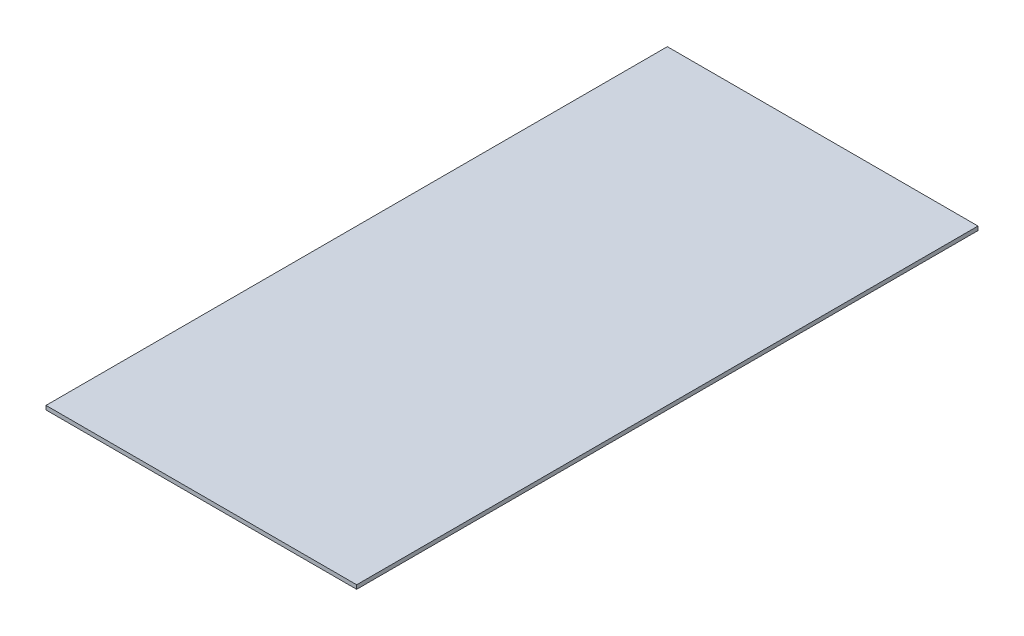
ISO-10303-21;
HEADER;
FILE_DESCRIPTION(('STEP AP214'),'2;1');
FILE_NAME('part.step','',(''),(''),'','','');
FILE_SCHEMA(('AUTOMOTIVE_DESIGN { 1 0 10303 214 1 1 1 1 }'));
ENDSEC;
DATA;
#1=APPLICATION_CONTEXT('core data for automotive mechanical design processes');
#2=APPLICATION_PROTOCOL_DEFINITION('international standard','automotive_design',2000,#1);
#3=PRODUCT_CONTEXT('',#1,'mechanical');
#4=PRODUCT('Part','Part','',(#3));
#5=PRODUCT_RELATED_PRODUCT_CATEGORY('part','',(#4));
#6=PRODUCT_DEFINITION_FORMATION('','',#4);
#7=PRODUCT_DEFINITION_CONTEXT('part definition',#1,'design');
#8=PRODUCT_DEFINITION('design','',#6,#7);
#9=PRODUCT_DEFINITION_SHAPE('','',#8);
#10=(LENGTH_UNIT() NAMED_UNIT(*) SI_UNIT(.MILLI.,.METRE.));
#11=(NAMED_UNIT(*) PLANE_ANGLE_UNIT() SI_UNIT($,.RADIAN.));
#12=(NAMED_UNIT(*) SI_UNIT($,.STERADIAN.) SOLID_ANGLE_UNIT());
#13=UNCERTAINTY_MEASURE_WITH_UNIT(LENGTH_MEASURE(1.E-05),#10,'distance_accuracy_value','');
#14=(GEOMETRIC_REPRESENTATION_CONTEXT(3) GLOBAL_UNCERTAINTY_ASSIGNED_CONTEXT((#13)) GLOBAL_UNIT_ASSIGNED_CONTEXT((#10,
#11,#12)) REPRESENTATION_CONTEXT('',''));
#15=CARTESIAN_POINT('',(0.,0.,0.));
#16=DIRECTION('',(0.,0.,1.));
#17=DIRECTION('',(1.,0.,0.));
#18=AXIS2_PLACEMENT_3D('',#15,#16,#17);
#19=CARTESIAN_POINT('',(123.825,1.5875,-247.65));
#20=DIRECTION('',(-1.,0.,0.));
#21=DIRECTION('',(0.,0.,1.));
#22=AXIS2_PLACEMENT_3D('',#19,#20,#21);
#23=PLANE('',#22);
#24=DIRECTION('',(0.,0.,-1.));
#25=VECTOR('',#24,1.);
#26=CARTESIAN_POINT('',(123.825,-1.5875,-247.65));
#27=LINE('',#26,#25);
#28=CARTESIAN_POINT('',(123.825,-1.5875,247.65));
#29=VERTEX_POINT('',#28);
#30=CARTESIAN_POINT('',(123.825,-1.5875,-247.65));
#31=VERTEX_POINT('',#30);
#32=EDGE_CURVE('E96',#29,#31,#27,.T.);
#33=ORIENTED_EDGE('',*,*,#32,.T.);
#34=DIRECTION('',(0.,-1.,0.));
#35=VECTOR('',#34,1.);
#36=CARTESIAN_POINT('',(123.825,1.5875,-247.65));
#37=LINE('',#36,#35);
#38=CARTESIAN_POINT('',(123.825,1.5875,-247.65));
#39=VERTEX_POINT('',#38);
#40=EDGE_CURVE('E11',#39,#31,#37,.T.);
#41=ORIENTED_EDGE('',*,*,#40,.F.);
#42=DIRECTION('',(0.,0.,-1.));
#43=VECTOR('',#42,1.);
#44=CARTESIAN_POINT('',(123.825,1.5875,-247.65));
#45=LINE('',#44,#43);
#46=CARTESIAN_POINT('',(123.825,1.5875,247.65));
#47=VERTEX_POINT('',#46);
#48=EDGE_CURVE('E84',#47,#39,#45,.T.);
#49=ORIENTED_EDGE('',*,*,#48,.F.);
#50=DIRECTION('',(0.,-1.,0.));
#51=VECTOR('',#50,1.);
#52=CARTESIAN_POINT('',(123.825,1.5875,247.65));
#53=LINE('',#52,#51);
#54=EDGE_CURVE('E92',#47,#29,#53,.T.);
#55=ORIENTED_EDGE('',*,*,#54,.T.);
#56=EDGE_LOOP('',(#33,#41,#49,#55));
#57=FACE_BOUND('',#56,.T.);
#58=ADVANCED_FACE('F33',(#57),#23,.F.);
#59=CARTESIAN_POINT('',(-123.825,1.5875,-247.65));
#60=DIRECTION('',(0.,0.,1.));
#61=DIRECTION('',(1.,0.,0.));
#62=AXIS2_PLACEMENT_3D('',#59,#60,#61);
#63=PLANE('',#62);
#64=DIRECTION('',(-1.,0.,0.));
#65=VECTOR('',#64,1.);
#66=CARTESIAN_POINT('',(-123.825,-1.5875,-247.65));
#67=LINE('',#66,#65);
#68=CARTESIAN_POINT('',(-123.825,-1.5875,-247.65));
#69=VERTEX_POINT('',#68);
#70=EDGE_CURVE('E88',#31,#69,#67,.T.);
#71=ORIENTED_EDGE('',*,*,#70,.T.);
#72=DIRECTION('',(0.,-1.,0.));
#73=VECTOR('',#72,1.);
#74=CARTESIAN_POINT('',(-123.825,1.5875,-247.65));
#75=LINE('',#74,#73);
#76=CARTESIAN_POINT('',(-123.825,1.5875,-247.65));
#77=VERTEX_POINT('',#76);
#78=EDGE_CURVE('E41',#77,#69,#75,.T.);
#79=ORIENTED_EDGE('',*,*,#78,.F.);
#80=DIRECTION('',(-1.,0.,0.));
#81=VECTOR('',#80,1.);
#82=CARTESIAN_POINT('',(-123.825,1.5875,-247.65));
#83=LINE('',#82,#81);
#84=EDGE_CURVE('E79',#39,#77,#83,.T.);
#85=ORIENTED_EDGE('',*,*,#84,.F.);
#86=ORIENTED_EDGE('',*,*,#40,.T.);
#87=EDGE_LOOP('',(#71,#79,#85,#86));
#88=FACE_BOUND('',#87,.T.);
#89=ADVANCED_FACE('F87',(#88),#63,.F.);
#90=CARTESIAN_POINT('',(-123.825,1.5875,-247.65));
#91=DIRECTION('',(1.,0.,0.));
#92=DIRECTION('',(0.,0.,-1.));
#93=AXIS2_PLACEMENT_3D('',#90,#91,#92);
#94=PLANE('',#93);
#95=DIRECTION('',(0.,0.,1.));
#96=VECTOR('',#95,1.);
#97=CARTESIAN_POINT('',(-123.825,-1.5875,-247.65));
#98=LINE('',#97,#96);
#99=CARTESIAN_POINT('',(-123.825,-1.5875,247.65));
#100=VERTEX_POINT('',#99);
#101=EDGE_CURVE('E66',#69,#100,#98,.T.);
#102=ORIENTED_EDGE('',*,*,#101,.T.);
#103=DIRECTION('',(0.,-1.,0.));
#104=VECTOR('',#103,1.);
#105=CARTESIAN_POINT('',(-123.825,1.5875,247.65));
#106=LINE('',#105,#104);
#107=CARTESIAN_POINT('',(-123.825,1.5875,247.65));
#108=VERTEX_POINT('',#107);
#109=EDGE_CURVE('E89',#108,#100,#106,.T.);
#110=ORIENTED_EDGE('',*,*,#109,.F.);
#111=DIRECTION('',(0.,0.,1.));
#112=VECTOR('',#111,1.);
#113=CARTESIAN_POINT('',(-123.825,1.5875,-247.65));
#114=LINE('',#113,#112);
#115=EDGE_CURVE('E82',#77,#108,#114,.T.);
#116=ORIENTED_EDGE('',*,*,#115,.F.);
#117=ORIENTED_EDGE('',*,*,#78,.T.);
#118=EDGE_LOOP('',(#102,#110,#116,#117));
#119=FACE_BOUND('',#118,.T.);
#120=ADVANCED_FACE('F90',(#119),#94,.F.);
#121=CARTESIAN_POINT('',(-123.825,1.5875,247.65));
#122=DIRECTION('',(0.,0.,-1.));
#123=DIRECTION('',(-1.,0.,0.));
#124=AXIS2_PLACEMENT_3D('',#121,#122,#123);
#125=PLANE('',#124);
#126=DIRECTION('',(1.,0.,0.));
#127=VECTOR('',#126,1.);
#128=CARTESIAN_POINT('',(-123.825,-1.5875,247.65));
#129=LINE('',#128,#127);
#130=EDGE_CURVE('E72',#100,#29,#129,.T.);
#131=ORIENTED_EDGE('',*,*,#130,.T.);
#132=ORIENTED_EDGE('',*,*,#54,.F.);
#133=DIRECTION('',(1.,0.,0.));
#134=VECTOR('',#133,1.);
#135=CARTESIAN_POINT('',(-123.825,1.5875,247.65));
#136=LINE('',#135,#134);
#137=EDGE_CURVE('E49',#108,#47,#136,.T.);
#138=ORIENTED_EDGE('',*,*,#137,.F.);
#139=ORIENTED_EDGE('',*,*,#109,.T.);
#140=EDGE_LOOP('',(#131,#132,#138,#139));
#141=FACE_BOUND('',#140,.T.);
#142=ADVANCED_FACE('F103',(#141),#125,.F.);
#143=CARTESIAN_POINT('',(0.,1.5875,0.));
#144=DIRECTION('',(0.,1.,0.));
#145=DIRECTION('',(0.,0.,1.));
#146=AXIS2_PLACEMENT_3D('',#143,#144,#145);
#147=PLANE('',#146);
#148=ORIENTED_EDGE('',*,*,#48,.T.);
#149=ORIENTED_EDGE('',*,*,#84,.T.);
#150=ORIENTED_EDGE('',*,*,#115,.T.);
#151=ORIENTED_EDGE('',*,*,#137,.T.);
#152=EDGE_LOOP('',(#148,#149,#150,#151));
#153=FACE_BOUND('',#152,.T.);
#154=ADVANCED_FACE('F80',(#153),#147,.T.);
#155=CARTESIAN_POINT('',(0.,-1.5875,0.));
#156=DIRECTION('',(0.,1.,0.));
#157=DIRECTION('',(0.,0.,1.));
#158=AXIS2_PLACEMENT_3D('',#155,#156,#157);
#159=PLANE('',#158);
#160=ORIENTED_EDGE('',*,*,#32,.F.);
#161=ORIENTED_EDGE('',*,*,#130,.F.);
#162=ORIENTED_EDGE('',*,*,#101,.F.);
#163=ORIENTED_EDGE('',*,*,#70,.F.);
#164=EDGE_LOOP('',(#160,#161,#162,#163));
#165=FACE_BOUND('',#164,.T.);
#166=ADVANCED_FACE('F106',(#165),#159,.F.);
#167=CLOSED_SHELL('',(#58,#89,#120,#142,#154,#166));
#168=MANIFOLD_SOLID_BREP('B2',#167);
#169=ADVANCED_BREP_SHAPE_REPRESENTATION('',(#18,#168),#14);
#170=SHAPE_DEFINITION_REPRESENTATION(#9,#169);
ENDSEC;
END-ISO-10303-21;
